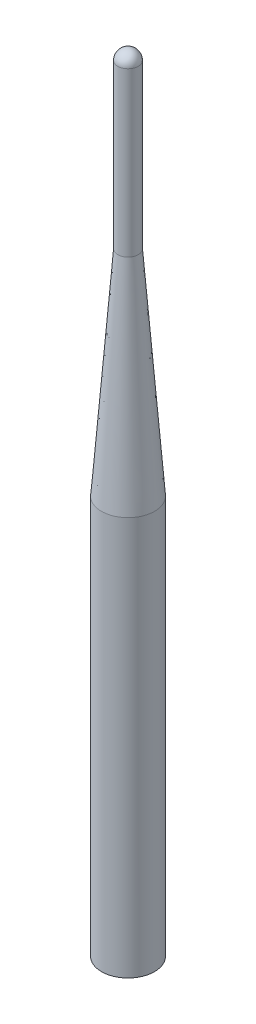
ISO-10303-21;
HEADER;
FILE_DESCRIPTION(('STEP AP214'),'2;1');
FILE_NAME('part.step','',(''),(''),'','','');
FILE_SCHEMA(('AUTOMOTIVE_DESIGN { 1 0 10303 214 1 1 1 1 }'));
ENDSEC;
DATA;
#1=APPLICATION_CONTEXT('core data for automotive mechanical design processes');
#2=APPLICATION_PROTOCOL_DEFINITION('international standard','automotive_design',2000,#1);
#3=PRODUCT_CONTEXT('',#1,'mechanical');
#4=PRODUCT('Part','Part','',(#3));
#5=PRODUCT_RELATED_PRODUCT_CATEGORY('part','',(#4));
#6=PRODUCT_DEFINITION_FORMATION('','',#4);
#7=PRODUCT_DEFINITION_CONTEXT('part definition',#1,'design');
#8=PRODUCT_DEFINITION('design','',#6,#7);
#9=PRODUCT_DEFINITION_SHAPE('','',#8);
#10=(LENGTH_UNIT() NAMED_UNIT(*) SI_UNIT(.MILLI.,.METRE.));
#11=(NAMED_UNIT(*) PLANE_ANGLE_UNIT() SI_UNIT($,.RADIAN.));
#12=(NAMED_UNIT(*) SI_UNIT($,.STERADIAN.) SOLID_ANGLE_UNIT());
#13=UNCERTAINTY_MEASURE_WITH_UNIT(LENGTH_MEASURE(1.E-05),#10,'distance_accuracy_value','');
#14=(GEOMETRIC_REPRESENTATION_CONTEXT(3) GLOBAL_UNCERTAINTY_ASSIGNED_CONTEXT((#13)) GLOBAL_UNIT_ASSIGNED_CONTEXT((#10,
#11,#12)) REPRESENTATION_CONTEXT('',''));
#15=CARTESIAN_POINT('',(0.,0.,0.));
#16=DIRECTION('',(0.,0.,1.));
#17=DIRECTION('',(1.,0.,0.));
#18=AXIS2_PLACEMENT_3D('',#15,#16,#17);
#19=CARTESIAN_POINT('',(0.,22.75,0.));
#20=DIRECTION('',(0.,-1.,0.));
#21=DIRECTION('',(0.,0.,-1.));
#22=AXIS2_PLACEMENT_3D('',#19,#20,#21);
#23=CYLINDRICAL_SURFACE('',#22,6.5);
#24=CARTESIAN_POINT('',(0.,0.,0.));
#25=DIRECTION('',(0.,1.,0.));
#26=DIRECTION('',(0.,0.,1.));
#27=AXIS2_PLACEMENT_3D('',#24,#25,#26);
#28=CIRCLE('',#27,6.5);
#29=CARTESIAN_POINT('',(0.,0.,6.5));
#30=VERTEX_POINT('',#29);
#31=EDGE_CURVE('E10',#30,#30,#28,.T.);
#32=ORIENTED_EDGE('',*,*,#31,.T.);
#33=EDGE_LOOP('',(#32));
#34=FACE_BOUND('',#33,.T.);
#35=CARTESIAN_POINT('',(0.,97.75,0.));
#36=DIRECTION('',(0.,-1.,0.));
#37=DIRECTION('',(0.,0.,-1.));
#38=AXIS2_PLACEMENT_3D('',#35,#36,#37);
#39=CIRCLE('',#38,6.5);
#40=CARTESIAN_POINT('',(0.,97.75,-6.5));
#41=VERTEX_POINT('',#40);
#42=EDGE_CURVE('E44',#41,#41,#39,.T.);
#43=ORIENTED_EDGE('',*,*,#42,.T.);
#44=EDGE_LOOP('',(#43));
#45=FACE_BOUND('',#44,.T.);
#46=ADVANCED_FACE('F37',(#34,#45),#23,.T.);
#47=CARTESIAN_POINT('',(0.,0.,0.));
#48=DIRECTION('',(0.,1.,0.));
#49=DIRECTION('',(0.,0.,1.));
#50=AXIS2_PLACEMENT_3D('',#47,#48,#49);
#51=PLANE('',#50);
#52=ORIENTED_EDGE('',*,*,#31,.F.);
#53=EDGE_LOOP('',(#52));
#54=FACE_BOUND('',#53,.T.);
#55=ADVANCED_FACE('F77',(#54),#51,.F.);
#56=CARTESIAN_POINT('',(0.,150.25,0.));
#57=DIRECTION('',(0.,-1.,0.));
#58=DIRECTION('',(0.,0.,-1.));
#59=AXIS2_PLACEMENT_3D('',#56,#57,#58);
#60=CONICAL_SURFACE('',#59,2.51,0.075854179688926);
#61=ORIENTED_EDGE('',*,*,#42,.F.);
#62=EDGE_LOOP('',(#61));
#63=FACE_BOUND('',#62,.T.);
#64=CARTESIAN_POINT('',(0.,150.25,0.));
#65=DIRECTION('',(0.,-1.,0.));
#66=DIRECTION('',(0.,0.,-1.));
#67=AXIS2_PLACEMENT_3D('',#64,#65,#66);
#68=CIRCLE('',#67,2.51);
#69=CARTESIAN_POINT('',(0.,150.25,-2.51));
#70=VERTEX_POINT('',#69);
#71=EDGE_CURVE('E49',#70,#70,#68,.T.);
#72=ORIENTED_EDGE('',*,*,#71,.T.);
#73=EDGE_LOOP('',(#72));
#74=FACE_BOUND('',#73,.T.);
#75=ADVANCED_FACE('F81',(#63,#74),#60,.T.);
#76=CARTESIAN_POINT('',(0.,22.75,0.));
#77=DIRECTION('',(0.,-1.,0.));
#78=DIRECTION('',(0.,0.,-1.));
#79=AXIS2_PLACEMENT_3D('',#76,#77,#78);
#80=CYLINDRICAL_SURFACE('',#79,2.51);
#81=ORIENTED_EDGE('',*,*,#71,.F.);
#82=EDGE_LOOP('',(#81));
#83=FACE_BOUND('',#82,.T.);
#84=CARTESIAN_POINT('',(0.,190.25,0.));
#85=DIRECTION('',(0.,-1.,0.));
#86=DIRECTION('',(0.,0.,-1.));
#87=AXIS2_PLACEMENT_3D('',#84,#85,#86);
#88=CIRCLE('',#87,2.51);
#89=CARTESIAN_POINT('',(0.,190.25,-2.51));
#90=VERTEX_POINT('',#89);
#91=EDGE_CURVE('E54',#90,#90,#88,.T.);
#92=ORIENTED_EDGE('',*,*,#91,.T.);
#93=EDGE_LOOP('',(#92));
#94=FACE_BOUND('',#93,.T.);
#95=ADVANCED_FACE('F73',(#83,#94),#80,.T.);
#96=CARTESIAN_POINT('',(0.,190.25,0.));
#97=DIRECTION('',(0.,-1.,0.));
#98=DIRECTION('',(0.,0.,-1.));
#99=AXIS2_PLACEMENT_3D('',#96,#97,#98);
#100=DEGENERATE_TOROIDAL_SURFACE('',#99,0.00999999999999959,2.5,.T.);
#101=ORIENTED_EDGE('',*,*,#91,.F.);
#102=EDGE_LOOP('',(#101));
#103=FACE_BOUND('',#102,.T.);
#104=CARTESIAN_POINT('',(0.,192.75,0.));
#105=DIRECTION('',(0.,-1.,0.));
#106=DIRECTION('',(0.,0.,-1.));
#107=AXIS2_PLACEMENT_3D('',#104,#105,#106);
#108=CIRCLE('',#107,0.00999999999999975);
#109=CARTESIAN_POINT('',(0.,192.75,-0.00999999999999975));
#110=VERTEX_POINT('',#109);
#111=EDGE_CURVE('E60',#110,#110,#108,.T.);
#112=ORIENTED_EDGE('',*,*,#111,.T.);
#113=EDGE_LOOP('',(#112));
#114=FACE_BOUND('',#113,.T.);
#115=ADVANCED_FACE('F65',(#103,#114),#100,.T.);
#116=CARTESIAN_POINT('',(-0.00999999999999959,192.75,0.));
#117=DIRECTION('',(0.,-1.,0.));
#118=DIRECTION('',(0.,0.,-1.));
#119=AXIS2_PLACEMENT_3D('',#116,#117,#118);
#120=PLANE('',#119);
#121=ORIENTED_EDGE('',*,*,#111,.F.);
#122=EDGE_LOOP('',(#121));
#123=FACE_BOUND('',#122,.T.);
#124=ADVANCED_FACE('F67',(#123),#120,.F.);
#125=CLOSED_SHELL('',(#46,#55,#75,#95,#115,#124));
#126=MANIFOLD_SOLID_BREP('B2',#125);
#127=ADVANCED_BREP_SHAPE_REPRESENTATION('',(#18,#126),#14);
#128=SHAPE_DEFINITION_REPRESENTATION(#9,#127);
ENDSEC;
END-ISO-10303-21;
